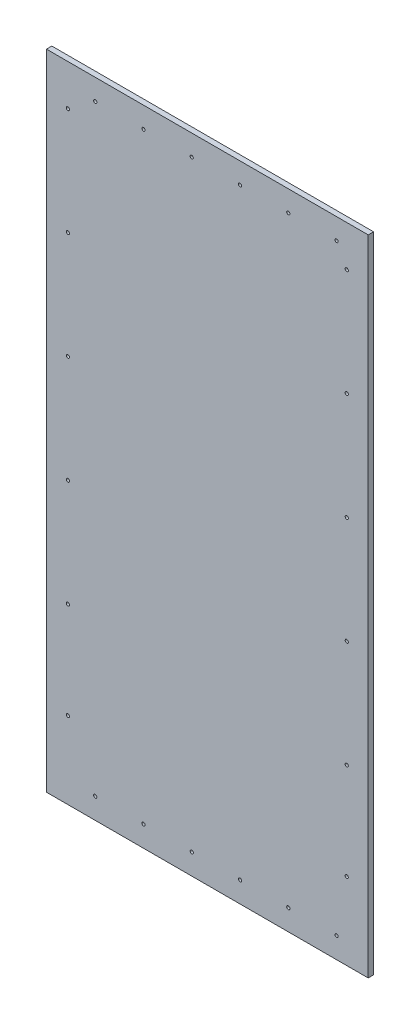
ISO-10303-21;
HEADER;
FILE_DESCRIPTION(('STEP AP214'),'2;1');
FILE_NAME('part.step','',(''),(''),'','','');
FILE_SCHEMA(('AUTOMOTIVE_DESIGN { 1 0 10303 214 1 1 1 1 }'));
ENDSEC;
DATA;
#1=APPLICATION_CONTEXT('core data for automotive mechanical design processes');
#2=APPLICATION_PROTOCOL_DEFINITION('international standard','automotive_design',2000,#1);
#3=PRODUCT_CONTEXT('',#1,'mechanical');
#4=PRODUCT('Part','Part','',(#3));
#5=PRODUCT_RELATED_PRODUCT_CATEGORY('part','',(#4));
#6=PRODUCT_DEFINITION_FORMATION('','',#4);
#7=PRODUCT_DEFINITION_CONTEXT('part definition',#1,'design');
#8=PRODUCT_DEFINITION('design','',#6,#7);
#9=PRODUCT_DEFINITION_SHAPE('','',#8);
#10=(LENGTH_UNIT() NAMED_UNIT(*) SI_UNIT(.MILLI.,.METRE.));
#11=(NAMED_UNIT(*) PLANE_ANGLE_UNIT() SI_UNIT($,.RADIAN.));
#12=(NAMED_UNIT(*) SI_UNIT($,.STERADIAN.) SOLID_ANGLE_UNIT());
#13=UNCERTAINTY_MEASURE_WITH_UNIT(LENGTH_MEASURE(1.E-05),#10,'distance_accuracy_value','');
#14=(GEOMETRIC_REPRESENTATION_CONTEXT(3) GLOBAL_UNCERTAINTY_ASSIGNED_CONTEXT((#13)) GLOBAL_UNIT_ASSIGNED_CONTEXT((#10,
#11,#12)) REPRESENTATION_CONTEXT('',''));
#15=CARTESIAN_POINT('',(0.,0.,0.));
#16=DIRECTION('',(0.,0.,1.));
#17=DIRECTION('',(1.,0.,0.));
#18=AXIS2_PLACEMENT_3D('',#15,#16,#17);
#19=CARTESIAN_POINT('',(150.,300.,5.));
#20=DIRECTION('',(-1.,0.,0.));
#21=DIRECTION('',(0.,-1.,0.));
#22=AXIS2_PLACEMENT_3D('',#19,#20,#21);
#23=PLANE('',#22);
#24=DIRECTION('',(0.,1.,0.));
#25=VECTOR('',#24,1.);
#26=CARTESIAN_POINT('',(150.,300.,0.));
#27=LINE('',#26,#25);
#28=CARTESIAN_POINT('',(150.,-300.,0.));
#29=VERTEX_POINT('',#28);
#30=CARTESIAN_POINT('',(150.,300.,0.));
#31=VERTEX_POINT('',#30);
#32=EDGE_CURVE('E108',#29,#31,#27,.T.);
#33=ORIENTED_EDGE('',*,*,#32,.T.);
#34=DIRECTION('',(0.,0.,-1.));
#35=VECTOR('',#34,1.);
#36=CARTESIAN_POINT('',(150.,300.,5.));
#37=LINE('',#36,#35);
#38=CARTESIAN_POINT('',(150.,300.,5.));
#39=VERTEX_POINT('',#38);
#40=EDGE_CURVE('E11',#39,#31,#37,.T.);
#41=ORIENTED_EDGE('',*,*,#40,.F.);
#42=DIRECTION('',(0.,1.,0.));
#43=VECTOR('',#42,1.);
#44=CARTESIAN_POINT('',(150.,300.,5.));
#45=LINE('',#44,#43);
#46=CARTESIAN_POINT('',(150.,-300.,5.));
#47=VERTEX_POINT('',#46);
#48=EDGE_CURVE('E92',#47,#39,#45,.T.);
#49=ORIENTED_EDGE('',*,*,#48,.F.);
#50=DIRECTION('',(0.,0.,-1.));
#51=VECTOR('',#50,1.);
#52=CARTESIAN_POINT('',(150.,-300.,5.));
#53=LINE('',#52,#51);
#54=EDGE_CURVE('E104',#47,#29,#53,.T.);
#55=ORIENTED_EDGE('',*,*,#54,.T.);
#56=EDGE_LOOP('',(#33,#41,#49,#55));
#57=FACE_BOUND('',#56,.T.);
#58=ADVANCED_FACE('F40',(#57),#23,.F.);
#59=CARTESIAN_POINT('',(-150.,300.,5.));
#60=DIRECTION('',(0.,-1.,0.));
#61=DIRECTION('',(0.,0.,-1.));
#62=AXIS2_PLACEMENT_3D('',#59,#60,#61);
#63=PLANE('',#62);
#64=DIRECTION('',(-1.,0.,0.));
#65=VECTOR('',#64,1.);
#66=CARTESIAN_POINT('',(-150.,300.,0.));
#67=LINE('',#66,#65);
#68=CARTESIAN_POINT('',(-150.,300.,0.));
#69=VERTEX_POINT('',#68);
#70=EDGE_CURVE('E97',#31,#69,#67,.T.);
#71=ORIENTED_EDGE('',*,*,#70,.T.);
#72=DIRECTION('',(0.,0.,-1.));
#73=VECTOR('',#72,1.);
#74=CARTESIAN_POINT('',(-150.,300.,5.));
#75=LINE('',#74,#73);
#76=CARTESIAN_POINT('',(-150.,300.,5.));
#77=VERTEX_POINT('',#76);
#78=EDGE_CURVE('E49',#77,#69,#75,.T.);
#79=ORIENTED_EDGE('',*,*,#78,.F.);
#80=DIRECTION('',(-1.,0.,0.));
#81=VECTOR('',#80,1.);
#82=CARTESIAN_POINT('',(-150.,300.,5.));
#83=LINE('',#82,#81);
#84=EDGE_CURVE('E87',#39,#77,#83,.T.);
#85=ORIENTED_EDGE('',*,*,#84,.F.);
#86=ORIENTED_EDGE('',*,*,#40,.T.);
#87=EDGE_LOOP('',(#71,#79,#85,#86));
#88=FACE_BOUND('',#87,.T.);
#89=ADVANCED_FACE('F96',(#88),#63,.F.);
#90=CARTESIAN_POINT('',(-150.,300.,5.));
#91=DIRECTION('',(1.,0.,0.));
#92=DIRECTION('',(0.,1.,0.));
#93=AXIS2_PLACEMENT_3D('',#90,#91,#92);
#94=PLANE('',#93);
#95=DIRECTION('',(0.,-1.,0.));
#96=VECTOR('',#95,1.);
#97=CARTESIAN_POINT('',(-150.,300.,0.));
#98=LINE('',#97,#96);
#99=CARTESIAN_POINT('',(-150.,-300.,0.));
#100=VERTEX_POINT('',#99);
#101=EDGE_CURVE('E74',#69,#100,#98,.T.);
#102=ORIENTED_EDGE('',*,*,#101,.T.);
#103=DIRECTION('',(0.,0.,-1.));
#104=VECTOR('',#103,1.);
#105=CARTESIAN_POINT('',(-150.,-300.,5.));
#106=LINE('',#105,#104);
#107=CARTESIAN_POINT('',(-150.,-300.,5.));
#108=VERTEX_POINT('',#107);
#109=EDGE_CURVE('E99',#108,#100,#106,.T.);
#110=ORIENTED_EDGE('',*,*,#109,.F.);
#111=DIRECTION('',(0.,-1.,0.));
#112=VECTOR('',#111,1.);
#113=CARTESIAN_POINT('',(-150.,300.,5.));
#114=LINE('',#113,#112);
#115=EDGE_CURVE('E90',#77,#108,#114,.T.);
#116=ORIENTED_EDGE('',*,*,#115,.F.);
#117=ORIENTED_EDGE('',*,*,#78,.T.);
#118=EDGE_LOOP('',(#102,#110,#116,#117));
#119=FACE_BOUND('',#118,.T.);
#120=ADVANCED_FACE('F100',(#119),#94,.F.);
#121=CARTESIAN_POINT('',(-150.,-300.,5.));
#122=DIRECTION('',(0.,1.,0.));
#123=DIRECTION('',(0.,0.,1.));
#124=AXIS2_PLACEMENT_3D('',#121,#122,#123);
#125=PLANE('',#124);
#126=DIRECTION('',(1.,0.,0.));
#127=VECTOR('',#126,1.);
#128=CARTESIAN_POINT('',(-150.,-300.,0.));
#129=LINE('',#128,#127);
#130=EDGE_CURVE('E80',#100,#29,#129,.T.);
#131=ORIENTED_EDGE('',*,*,#130,.T.);
#132=ORIENTED_EDGE('',*,*,#54,.F.);
#133=DIRECTION('',(1.,0.,0.));
#134=VECTOR('',#133,1.);
#135=CARTESIAN_POINT('',(-150.,-300.,5.));
#136=LINE('',#135,#134);
#137=EDGE_CURVE('E57',#108,#47,#136,.T.);
#138=ORIENTED_EDGE('',*,*,#137,.F.);
#139=ORIENTED_EDGE('',*,*,#109,.T.);
#140=EDGE_LOOP('',(#131,#132,#138,#139));
#141=FACE_BOUND('',#140,.T.);
#142=ADVANCED_FACE('F122',(#141),#125,.F.);
#143=CARTESIAN_POINT('',(0.,0.,5.));
#144=DIRECTION('',(0.,0.,1.));
#145=DIRECTION('',(1.,0.,0.));
#146=AXIS2_PLACEMENT_3D('',#143,#144,#145);
#147=PLANE('',#146);
#148=CARTESIAN_POINT('',(130.,-38.12,5.));
#149=DIRECTION('',(0.,0.,1.));
#150=DIRECTION('',(-1.,0.,0.));
#151=AXIS2_PLACEMENT_3D('',#148,#149,#150);
#152=CIRCLE('',#151,1.5);
#153=CARTESIAN_POINT('',(128.5,-38.12,5.));
#154=VERTEX_POINT('',#153);
#155=EDGE_CURVE('E265',#154,#154,#152,.T.);
#156=ORIENTED_EDGE('',*,*,#155,.F.);
#157=EDGE_LOOP('',(#156));
#158=FACE_BOUND('',#157,.T.);
#159=CARTESIAN_POINT('',(130.,-138.12,5.));
#160=DIRECTION('',(0.,0.,1.));
#161=DIRECTION('',(-1.,0.,0.));
#162=AXIS2_PLACEMENT_3D('',#159,#160,#161);
#163=CIRCLE('',#162,1.5);
#164=CARTESIAN_POINT('',(128.5,-138.12,5.));
#165=VERTEX_POINT('',#164);
#166=EDGE_CURVE('E274',#165,#165,#163,.T.);
#167=ORIENTED_EDGE('',*,*,#166,.F.);
#168=EDGE_LOOP('',(#167));
#169=FACE_BOUND('',#168,.T.);
#170=CARTESIAN_POINT('',(130.,-228.12,5.));
#171=DIRECTION('',(0.,0.,1.));
#172=DIRECTION('',(-1.,0.,0.));
#173=AXIS2_PLACEMENT_3D('',#170,#171,#172);
#174=CIRCLE('',#173,1.5);
#175=CARTESIAN_POINT('',(128.5,-228.12,5.));
#176=VERTEX_POINT('',#175);
#177=EDGE_CURVE('E282',#176,#176,#174,.T.);
#178=ORIENTED_EDGE('',*,*,#177,.F.);
#179=EDGE_LOOP('',(#178));
#180=FACE_BOUND('',#179,.T.);
#181=CARTESIAN_POINT('',(-130.,-228.12,5.));
#182=DIRECTION('',(0.,0.,1.));
#183=DIRECTION('',(1.,0.,0.));
#184=AXIS2_PLACEMENT_3D('',#181,#182,#183);
#185=CIRCLE('',#184,1.5);
#186=CARTESIAN_POINT('',(-128.5,-228.12,5.));
#187=VERTEX_POINT('',#186);
#188=EDGE_CURVE('E290',#187,#187,#185,.T.);
#189=ORIENTED_EDGE('',*,*,#188,.F.);
#190=EDGE_LOOP('',(#189));
#191=FACE_BOUND('',#190,.T.);
#192=CARTESIAN_POINT('',(-130.,-138.12,5.));
#193=DIRECTION('',(0.,0.,1.));
#194=DIRECTION('',(1.,0.,0.));
#195=AXIS2_PLACEMENT_3D('',#192,#193,#194);
#196=CIRCLE('',#195,1.5);
#197=CARTESIAN_POINT('',(-128.5,-138.12,5.));
#198=VERTEX_POINT('',#197);
#199=EDGE_CURVE('E233',#198,#198,#196,.T.);
#200=ORIENTED_EDGE('',*,*,#199,.F.);
#201=EDGE_LOOP('',(#200));
#202=FACE_BOUND('',#201,.T.);
#203=CARTESIAN_POINT('',(-130.,-38.12,5.));
#204=DIRECTION('',(0.,0.,1.));
#205=DIRECTION('',(1.,0.,0.));
#206=AXIS2_PLACEMENT_3D('',#203,#204,#205);
#207=CIRCLE('',#206,1.5);
#208=CARTESIAN_POINT('',(-128.5,-38.12,5.));
#209=VERTEX_POINT('',#208);
#210=EDGE_CURVE('E242',#209,#209,#207,.T.);
#211=ORIENTED_EDGE('',*,*,#210,.F.);
#212=EDGE_LOOP('',(#211));
#213=FACE_BOUND('',#212,.T.);
#214=CARTESIAN_POINT('',(-130.,61.88,5.));
#215=DIRECTION('',(0.,0.,1.));
#216=DIRECTION('',(1.,0.,0.));
#217=AXIS2_PLACEMENT_3D('',#214,#215,#216);
#218=CIRCLE('',#217,1.5);
#219=CARTESIAN_POINT('',(-128.5,61.88,5.));
#220=VERTEX_POINT('',#219);
#221=EDGE_CURVE('E250',#220,#220,#218,.T.);
#222=ORIENTED_EDGE('',*,*,#221,.F.);
#223=EDGE_LOOP('',(#222));
#224=FACE_BOUND('',#223,.T.);
#225=CARTESIAN_POINT('',(-130.,161.88,5.));
#226=DIRECTION('',(0.,0.,1.));
#227=DIRECTION('',(1.,0.,0.));
#228=AXIS2_PLACEMENT_3D('',#225,#226,#227);
#229=CIRCLE('',#228,1.5);
#230=CARTESIAN_POINT('',(-128.5,161.88,5.));
#231=VERTEX_POINT('',#230);
#232=EDGE_CURVE('E258',#231,#231,#229,.T.);
#233=ORIENTED_EDGE('',*,*,#232,.F.);
#234=EDGE_LOOP('',(#233));
#235=FACE_BOUND('',#234,.T.);
#236=CARTESIAN_POINT('',(130.,61.8800000000001,5.));
#237=DIRECTION('',(0.,0.,1.));
#238=DIRECTION('',(-1.,0.,0.));
#239=AXIS2_PLACEMENT_3D('',#236,#237,#238);
#240=CIRCLE('',#239,1.5);
#241=CARTESIAN_POINT('',(128.5,61.8800000000001,5.));
#242=VERTEX_POINT('',#241);
#243=EDGE_CURVE('E313',#242,#242,#240,.T.);
#244=ORIENTED_EDGE('',*,*,#243,.F.);
#245=EDGE_LOOP('',(#244));
#246=FACE_BOUND('',#245,.T.);
#247=CARTESIAN_POINT('',(130.,161.88,5.));
#248=DIRECTION('',(0.,0.,1.));
#249=DIRECTION('',(-1.,0.,0.));
#250=AXIS2_PLACEMENT_3D('',#247,#248,#249);
#251=CIRCLE('',#250,1.5);
#252=CARTESIAN_POINT('',(128.5,161.88,5.));
#253=VERTEX_POINT('',#252);
#254=EDGE_CURVE('E305',#253,#253,#251,.T.);
#255=ORIENTED_EDGE('',*,*,#254,.F.);
#256=EDGE_LOOP('',(#255));
#257=FACE_BOUND('',#256,.T.);
#258=CARTESIAN_POINT('',(130.,261.88,5.));
#259=DIRECTION('',(0.,0.,1.));
#260=DIRECTION('',(-1.,0.,0.));
#261=AXIS2_PLACEMENT_3D('',#258,#259,#260);
#262=CIRCLE('',#261,1.5);
#263=CARTESIAN_POINT('',(128.5,261.88,5.));
#264=VERTEX_POINT('',#263);
#265=EDGE_CURVE('E297',#264,#264,#262,.T.);
#266=ORIENTED_EDGE('',*,*,#265,.F.);
#267=EDGE_LOOP('',(#266));
#268=FACE_BOUND('',#267,.T.);
#269=CARTESIAN_POINT('',(-130.,261.88,5.));
#270=DIRECTION('',(0.,0.,1.));
#271=DIRECTION('',(1.,0.,0.));
#272=AXIS2_PLACEMENT_3D('',#269,#270,#271);
#273=CIRCLE('',#272,1.5);
#274=CARTESIAN_POINT('',(-128.5,261.88,5.));
#275=VERTEX_POINT('',#274);
#276=EDGE_CURVE('E225',#275,#275,#273,.T.);
#277=ORIENTED_EDGE('',*,*,#276,.F.);
#278=EDGE_LOOP('',(#277));
#279=FACE_BOUND('',#278,.T.);
#280=CARTESIAN_POINT('',(30.5000000000001,-280.5,5.));
#281=DIRECTION('',(0.,0.,1.));
#282=DIRECTION('',(-1.,0.,0.));
#283=AXIS2_PLACEMENT_3D('',#280,#281,#282);
#284=CIRCLE('',#283,1.5);
#285=CARTESIAN_POINT('',(29.0000000000001,-280.5,5.));
#286=VERTEX_POINT('',#285);
#287=EDGE_CURVE('E169',#286,#286,#284,.T.);
#288=ORIENTED_EDGE('',*,*,#287,.F.);
#289=EDGE_LOOP('',(#288));
#290=FACE_BOUND('',#289,.T.);
#291=CARTESIAN_POINT('',(75.5000000000001,-280.5,5.));
#292=DIRECTION('',(0.,0.,1.));
#293=DIRECTION('',(-1.,0.,0.));
#294=AXIS2_PLACEMENT_3D('',#291,#292,#293);
#295=CIRCLE('',#294,1.5);
#296=CARTESIAN_POINT('',(74.0000000000001,-280.5,5.));
#297=VERTEX_POINT('',#296);
#298=EDGE_CURVE('E178',#297,#297,#295,.T.);
#299=ORIENTED_EDGE('',*,*,#298,.F.);
#300=EDGE_LOOP('',(#299));
#301=FACE_BOUND('',#300,.T.);
#302=CARTESIAN_POINT('',(120.5,-280.5,5.));
#303=DIRECTION('',(0.,0.,1.));
#304=DIRECTION('',(-1.,0.,0.));
#305=AXIS2_PLACEMENT_3D('',#302,#303,#304);
#306=CIRCLE('',#305,1.5);
#307=CARTESIAN_POINT('',(119.,-280.5,5.));
#308=VERTEX_POINT('',#307);
#309=EDGE_CURVE('E186',#308,#308,#306,.T.);
#310=ORIENTED_EDGE('',*,*,#309,.F.);
#311=EDGE_LOOP('',(#310));
#312=FACE_BOUND('',#311,.T.);
#313=CARTESIAN_POINT('',(120.5,280.5,5.));
#314=DIRECTION('',(0.,0.,1.));
#315=DIRECTION('',(1.,0.,0.));
#316=AXIS2_PLACEMENT_3D('',#313,#314,#315);
#317=CIRCLE('',#316,1.5);
#318=CARTESIAN_POINT('',(122.,280.5,5.));
#319=VERTEX_POINT('',#318);
#320=EDGE_CURVE('E194',#319,#319,#317,.T.);
#321=ORIENTED_EDGE('',*,*,#320,.F.);
#322=EDGE_LOOP('',(#321));
#323=FACE_BOUND('',#322,.T.);
#324=CARTESIAN_POINT('',(75.5,280.5,5.));
#325=DIRECTION('',(0.,0.,1.));
#326=DIRECTION('',(1.,0.,0.));
#327=AXIS2_PLACEMENT_3D('',#324,#325,#326);
#328=CIRCLE('',#327,1.5);
#329=CARTESIAN_POINT('',(77.,280.5,5.));
#330=VERTEX_POINT('',#329);
#331=EDGE_CURVE('E137',#330,#330,#328,.T.);
#332=ORIENTED_EDGE('',*,*,#331,.F.);
#333=EDGE_LOOP('',(#332));
#334=FACE_BOUND('',#333,.T.);
#335=CARTESIAN_POINT('',(30.5,280.5,5.));
#336=DIRECTION('',(0.,0.,1.));
#337=DIRECTION('',(1.,0.,0.));
#338=AXIS2_PLACEMENT_3D('',#335,#336,#337);
#339=CIRCLE('',#338,1.5);
#340=CARTESIAN_POINT('',(32.,280.5,5.));
#341=VERTEX_POINT('',#340);
#342=EDGE_CURVE('E146',#341,#341,#339,.T.);
#343=ORIENTED_EDGE('',*,*,#342,.F.);
#344=EDGE_LOOP('',(#343));
#345=FACE_BOUND('',#344,.T.);
#346=CARTESIAN_POINT('',(-14.5,280.5,5.));
#347=DIRECTION('',(0.,0.,1.));
#348=DIRECTION('',(1.,0.,0.));
#349=AXIS2_PLACEMENT_3D('',#346,#347,#348);
#350=CIRCLE('',#349,1.5);
#351=CARTESIAN_POINT('',(-13.,280.5,5.));
#352=VERTEX_POINT('',#351);
#353=EDGE_CURVE('E154',#352,#352,#350,.T.);
#354=ORIENTED_EDGE('',*,*,#353,.F.);
#355=EDGE_LOOP('',(#354));
#356=FACE_BOUND('',#355,.T.);
#357=CARTESIAN_POINT('',(-59.5,280.5,5.));
#358=DIRECTION('',(0.,0.,1.));
#359=DIRECTION('',(1.,0.,0.));
#360=AXIS2_PLACEMENT_3D('',#357,#358,#359);
#361=CIRCLE('',#360,1.5);
#362=CARTESIAN_POINT('',(-58.,280.5,5.));
#363=VERTEX_POINT('',#362);
#364=EDGE_CURVE('E162',#363,#363,#361,.T.);
#365=ORIENTED_EDGE('',*,*,#364,.F.);
#366=EDGE_LOOP('',(#365));
#367=FACE_BOUND('',#366,.T.);
#368=CARTESIAN_POINT('',(-14.4999999999999,-280.5,5.));
#369=DIRECTION('',(0.,0.,1.));
#370=DIRECTION('',(-1.,0.,0.));
#371=AXIS2_PLACEMENT_3D('',#368,#369,#370);
#372=CIRCLE('',#371,1.5);
#373=CARTESIAN_POINT('',(-15.9999999999999,-280.5,5.));
#374=VERTEX_POINT('',#373);
#375=EDGE_CURVE('E218',#374,#374,#372,.T.);
#376=ORIENTED_EDGE('',*,*,#375,.F.);
#377=EDGE_LOOP('',(#376));
#378=FACE_BOUND('',#377,.T.);
#379=CARTESIAN_POINT('',(-59.4999999999999,-280.5,5.));
#380=DIRECTION('',(0.,0.,1.));
#381=DIRECTION('',(-1.,0.,0.));
#382=AXIS2_PLACEMENT_3D('',#379,#380,#381);
#383=CIRCLE('',#382,1.5);
#384=CARTESIAN_POINT('',(-60.9999999999999,-280.5,5.));
#385=VERTEX_POINT('',#384);
#386=EDGE_CURVE('E210',#385,#385,#383,.T.);
#387=ORIENTED_EDGE('',*,*,#386,.F.);
#388=EDGE_LOOP('',(#387));
#389=FACE_BOUND('',#388,.T.);
#390=CARTESIAN_POINT('',(-104.5,-280.5,5.));
#391=DIRECTION('',(0.,0.,1.));
#392=DIRECTION('',(-1.,0.,0.));
#393=AXIS2_PLACEMENT_3D('',#390,#391,#392);
#394=CIRCLE('',#393,1.5);
#395=CARTESIAN_POINT('',(-106.,-280.5,5.));
#396=VERTEX_POINT('',#395);
#397=EDGE_CURVE('E201',#396,#396,#394,.T.);
#398=ORIENTED_EDGE('',*,*,#397,.F.);
#399=EDGE_LOOP('',(#398));
#400=FACE_BOUND('',#399,.T.);
#401=CARTESIAN_POINT('',(-104.5,280.5,5.));
#402=DIRECTION('',(0.,0.,1.));
#403=DIRECTION('',(1.,0.,0.));
#404=AXIS2_PLACEMENT_3D('',#401,#402,#403);
#405=CIRCLE('',#404,1.5);
#406=CARTESIAN_POINT('',(-103.,280.5,5.));
#407=VERTEX_POINT('',#406);
#408=EDGE_CURVE('E129',#407,#407,#405,.T.);
#409=ORIENTED_EDGE('',*,*,#408,.F.);
#410=EDGE_LOOP('',(#409));
#411=FACE_BOUND('',#410,.T.);
#412=ORIENTED_EDGE('',*,*,#48,.T.);
#413=ORIENTED_EDGE('',*,*,#84,.T.);
#414=ORIENTED_EDGE('',*,*,#115,.T.);
#415=ORIENTED_EDGE('',*,*,#137,.T.);
#416=EDGE_LOOP('',(#412,#413,#414,#415));
#417=FACE_BOUND('',#416,.T.);
#418=ADVANCED_FACE('F88',(#158,#169,#180,#191,#202,#213,#224,#235,#246,#257,#268,#279,#290,#301,
#312,#323,#334,#345,#356,#367,#378,#389,#400,#411,#417),#147,.T.);
#419=CARTESIAN_POINT('',(0.,0.,0.));
#420=DIRECTION('',(0.,0.,1.));
#421=DIRECTION('',(1.,0.,0.));
#422=AXIS2_PLACEMENT_3D('',#419,#420,#421);
#423=PLANE('',#422);
#424=CARTESIAN_POINT('',(130.,-38.12,0.));
#425=DIRECTION('',(0.,0.,1.));
#426=DIRECTION('',(-1.,0.,0.));
#427=AXIS2_PLACEMENT_3D('',#424,#425,#426);
#428=CIRCLE('',#427,1.5);
#429=CARTESIAN_POINT('',(128.5,-38.12,0.));
#430=VERTEX_POINT('',#429);
#431=EDGE_CURVE('E269',#430,#430,#428,.T.);
#432=ORIENTED_EDGE('',*,*,#431,.T.);
#433=EDGE_LOOP('',(#432));
#434=FACE_BOUND('',#433,.T.);
#435=CARTESIAN_POINT('',(130.,-138.12,0.));
#436=DIRECTION('',(0.,0.,1.));
#437=DIRECTION('',(-1.,0.,0.));
#438=AXIS2_PLACEMENT_3D('',#435,#436,#437);
#439=CIRCLE('',#438,1.5);
#440=CARTESIAN_POINT('',(128.5,-138.12,0.));
#441=VERTEX_POINT('',#440);
#442=EDGE_CURVE('E278',#441,#441,#439,.T.);
#443=ORIENTED_EDGE('',*,*,#442,.T.);
#444=EDGE_LOOP('',(#443));
#445=FACE_BOUND('',#444,.T.);
#446=CARTESIAN_POINT('',(130.,-228.12,0.));
#447=DIRECTION('',(0.,0.,1.));
#448=DIRECTION('',(-1.,0.,0.));
#449=AXIS2_PLACEMENT_3D('',#446,#447,#448);
#450=CIRCLE('',#449,1.5);
#451=CARTESIAN_POINT('',(128.5,-228.12,0.));
#452=VERTEX_POINT('',#451);
#453=EDGE_CURVE('E286',#452,#452,#450,.T.);
#454=ORIENTED_EDGE('',*,*,#453,.T.);
#455=EDGE_LOOP('',(#454));
#456=FACE_BOUND('',#455,.T.);
#457=CARTESIAN_POINT('',(-130.,-228.12,0.));
#458=DIRECTION('',(0.,0.,1.));
#459=DIRECTION('',(1.,0.,0.));
#460=AXIS2_PLACEMENT_3D('',#457,#458,#459);
#461=CIRCLE('',#460,1.5);
#462=CARTESIAN_POINT('',(-128.5,-228.12,0.));
#463=VERTEX_POINT('',#462);
#464=EDGE_CURVE('E238',#463,#463,#461,.T.);
#465=ORIENTED_EDGE('',*,*,#464,.T.);
#466=EDGE_LOOP('',(#465));
#467=FACE_BOUND('',#466,.T.);
#468=CARTESIAN_POINT('',(-130.,-138.12,0.));
#469=DIRECTION('',(0.,0.,1.));
#470=DIRECTION('',(1.,0.,0.));
#471=AXIS2_PLACEMENT_3D('',#468,#469,#470);
#472=CIRCLE('',#471,1.5);
#473=CARTESIAN_POINT('',(-128.5,-138.12,0.));
#474=VERTEX_POINT('',#473);
#475=EDGE_CURVE('E237',#474,#474,#472,.T.);
#476=ORIENTED_EDGE('',*,*,#475,.T.);
#477=EDGE_LOOP('',(#476));
#478=FACE_BOUND('',#477,.T.);
#479=CARTESIAN_POINT('',(-130.,-38.12,0.));
#480=DIRECTION('',(0.,0.,1.));
#481=DIRECTION('',(1.,0.,0.));
#482=AXIS2_PLACEMENT_3D('',#479,#480,#481);
#483=CIRCLE('',#482,1.5);
#484=CARTESIAN_POINT('',(-128.5,-38.12,0.));
#485=VERTEX_POINT('',#484);
#486=EDGE_CURVE('E246',#485,#485,#483,.T.);
#487=ORIENTED_EDGE('',*,*,#486,.T.);
#488=EDGE_LOOP('',(#487));
#489=FACE_BOUND('',#488,.T.);
#490=CARTESIAN_POINT('',(-130.,61.88,0.));
#491=DIRECTION('',(0.,0.,1.));
#492=DIRECTION('',(1.,0.,0.));
#493=AXIS2_PLACEMENT_3D('',#490,#491,#492);
#494=CIRCLE('',#493,1.5);
#495=CARTESIAN_POINT('',(-128.5,61.88,0.));
#496=VERTEX_POINT('',#495);
#497=EDGE_CURVE('E254',#496,#496,#494,.T.);
#498=ORIENTED_EDGE('',*,*,#497,.T.);
#499=EDGE_LOOP('',(#498));
#500=FACE_BOUND('',#499,.T.);
#501=CARTESIAN_POINT('',(-130.,161.88,0.));
#502=DIRECTION('',(0.,0.,1.));
#503=DIRECTION('',(1.,0.,0.));
#504=AXIS2_PLACEMENT_3D('',#501,#502,#503);
#505=CIRCLE('',#504,1.5);
#506=CARTESIAN_POINT('',(-128.5,161.88,0.));
#507=VERTEX_POINT('',#506);
#508=EDGE_CURVE('E229',#507,#507,#505,.T.);
#509=ORIENTED_EDGE('',*,*,#508,.T.);
#510=EDGE_LOOP('',(#509));
#511=FACE_BOUND('',#510,.T.);
#512=CARTESIAN_POINT('',(130.,61.8800000000001,0.));
#513=DIRECTION('',(0.,0.,1.));
#514=DIRECTION('',(-1.,0.,0.));
#515=AXIS2_PLACEMENT_3D('',#512,#513,#514);
#516=CIRCLE('',#515,1.5);
#517=CARTESIAN_POINT('',(128.5,61.8800000000001,0.));
#518=VERTEX_POINT('',#517);
#519=EDGE_CURVE('E270',#518,#518,#516,.T.);
#520=ORIENTED_EDGE('',*,*,#519,.T.);
#521=EDGE_LOOP('',(#520));
#522=FACE_BOUND('',#521,.T.);
#523=CARTESIAN_POINT('',(130.,161.88,0.));
#524=DIRECTION('',(0.,0.,1.));
#525=DIRECTION('',(-1.,0.,0.));
#526=AXIS2_PLACEMENT_3D('',#523,#524,#525);
#527=CIRCLE('',#526,1.5);
#528=CARTESIAN_POINT('',(128.5,161.88,0.));
#529=VERTEX_POINT('',#528);
#530=EDGE_CURVE('E309',#529,#529,#527,.T.);
#531=ORIENTED_EDGE('',*,*,#530,.T.);
#532=EDGE_LOOP('',(#531));
#533=FACE_BOUND('',#532,.T.);
#534=CARTESIAN_POINT('',(130.,261.88,0.));
#535=DIRECTION('',(0.,0.,1.));
#536=DIRECTION('',(-1.,0.,0.));
#537=AXIS2_PLACEMENT_3D('',#534,#535,#536);
#538=CIRCLE('',#537,1.5);
#539=CARTESIAN_POINT('',(128.5,261.88,0.));
#540=VERTEX_POINT('',#539);
#541=EDGE_CURVE('E301',#540,#540,#538,.T.);
#542=ORIENTED_EDGE('',*,*,#541,.T.);
#543=EDGE_LOOP('',(#542));
#544=FACE_BOUND('',#543,.T.);
#545=CARTESIAN_POINT('',(-130.,261.88,0.));
#546=DIRECTION('',(0.,0.,1.));
#547=DIRECTION('',(1.,0.,0.));
#548=AXIS2_PLACEMENT_3D('',#545,#546,#547);
#549=CIRCLE('',#548,1.5);
#550=CARTESIAN_POINT('',(-128.5,261.88,0.));
#551=VERTEX_POINT('',#550);
#552=EDGE_CURVE('E206',#551,#551,#549,.T.);
#553=ORIENTED_EDGE('',*,*,#552,.T.);
#554=EDGE_LOOP('',(#553));
#555=FACE_BOUND('',#554,.T.);
#556=CARTESIAN_POINT('',(30.5000000000001,-280.5,0.));
#557=DIRECTION('',(0.,0.,1.));
#558=DIRECTION('',(-1.,0.,0.));
#559=AXIS2_PLACEMENT_3D('',#556,#557,#558);
#560=CIRCLE('',#559,1.5);
#561=CARTESIAN_POINT('',(29.0000000000001,-280.5,0.));
#562=VERTEX_POINT('',#561);
#563=EDGE_CURVE('E173',#562,#562,#560,.T.);
#564=ORIENTED_EDGE('',*,*,#563,.T.);
#565=EDGE_LOOP('',(#564));
#566=FACE_BOUND('',#565,.T.);
#567=CARTESIAN_POINT('',(75.5000000000001,-280.5,0.));
#568=DIRECTION('',(0.,0.,1.));
#569=DIRECTION('',(-1.,0.,0.));
#570=AXIS2_PLACEMENT_3D('',#567,#568,#569);
#571=CIRCLE('',#570,1.5);
#572=CARTESIAN_POINT('',(74.0000000000001,-280.5,0.));
#573=VERTEX_POINT('',#572);
#574=EDGE_CURVE('E182',#573,#573,#571,.T.);
#575=ORIENTED_EDGE('',*,*,#574,.T.);
#576=EDGE_LOOP('',(#575));
#577=FACE_BOUND('',#576,.T.);
#578=CARTESIAN_POINT('',(120.5,-280.5,0.));
#579=DIRECTION('',(0.,0.,1.));
#580=DIRECTION('',(-1.,0.,0.));
#581=AXIS2_PLACEMENT_3D('',#578,#579,#580);
#582=CIRCLE('',#581,1.5);
#583=CARTESIAN_POINT('',(119.,-280.5,0.));
#584=VERTEX_POINT('',#583);
#585=EDGE_CURVE('E190',#584,#584,#582,.T.);
#586=ORIENTED_EDGE('',*,*,#585,.T.);
#587=EDGE_LOOP('',(#586));
#588=FACE_BOUND('',#587,.T.);
#589=CARTESIAN_POINT('',(120.5,280.5,0.));
#590=DIRECTION('',(0.,0.,1.));
#591=DIRECTION('',(1.,0.,0.));
#592=AXIS2_PLACEMENT_3D('',#589,#590,#591);
#593=CIRCLE('',#592,1.5);
#594=CARTESIAN_POINT('',(122.,280.5,0.));
#595=VERTEX_POINT('',#594);
#596=EDGE_CURVE('E142',#595,#595,#593,.T.);
#597=ORIENTED_EDGE('',*,*,#596,.T.);
#598=EDGE_LOOP('',(#597));
#599=FACE_BOUND('',#598,.T.);
#600=CARTESIAN_POINT('',(75.5,280.5,0.));
#601=DIRECTION('',(0.,0.,1.));
#602=DIRECTION('',(1.,0.,0.));
#603=AXIS2_PLACEMENT_3D('',#600,#601,#602);
#604=CIRCLE('',#603,1.5);
#605=CARTESIAN_POINT('',(77.,280.5,0.));
#606=VERTEX_POINT('',#605);
#607=EDGE_CURVE('E141',#606,#606,#604,.T.);
#608=ORIENTED_EDGE('',*,*,#607,.T.);
#609=EDGE_LOOP('',(#608));
#610=FACE_BOUND('',#609,.T.);
#611=CARTESIAN_POINT('',(30.5,280.5,0.));
#612=DIRECTION('',(0.,0.,1.));
#613=DIRECTION('',(1.,0.,0.));
#614=AXIS2_PLACEMENT_3D('',#611,#612,#613);
#615=CIRCLE('',#614,1.5);
#616=CARTESIAN_POINT('',(32.,280.5,0.));
#617=VERTEX_POINT('',#616);
#618=EDGE_CURVE('E150',#617,#617,#615,.T.);
#619=ORIENTED_EDGE('',*,*,#618,.T.);
#620=EDGE_LOOP('',(#619));
#621=FACE_BOUND('',#620,.T.);
#622=CARTESIAN_POINT('',(-14.5,280.5,0.));
#623=DIRECTION('',(0.,0.,1.));
#624=DIRECTION('',(1.,0.,0.));
#625=AXIS2_PLACEMENT_3D('',#622,#623,#624);
#626=CIRCLE('',#625,1.5);
#627=CARTESIAN_POINT('',(-13.,280.5,0.));
#628=VERTEX_POINT('',#627);
#629=EDGE_CURVE('E158',#628,#628,#626,.T.);
#630=ORIENTED_EDGE('',*,*,#629,.T.);
#631=EDGE_LOOP('',(#630));
#632=FACE_BOUND('',#631,.T.);
#633=CARTESIAN_POINT('',(-59.5,280.5,0.));
#634=DIRECTION('',(0.,0.,1.));
#635=DIRECTION('',(1.,0.,0.));
#636=AXIS2_PLACEMENT_3D('',#633,#634,#635);
#637=CIRCLE('',#636,1.5);
#638=CARTESIAN_POINT('',(-58.,280.5,0.));
#639=VERTEX_POINT('',#638);
#640=EDGE_CURVE('E133',#639,#639,#637,.T.);
#641=ORIENTED_EDGE('',*,*,#640,.T.);
#642=EDGE_LOOP('',(#641));
#643=FACE_BOUND('',#642,.T.);
#644=CARTESIAN_POINT('',(-14.4999999999999,-280.5,0.));
#645=DIRECTION('',(0.,0.,1.));
#646=DIRECTION('',(-1.,0.,0.));
#647=AXIS2_PLACEMENT_3D('',#644,#645,#646);
#648=CIRCLE('',#647,1.5);
#649=CARTESIAN_POINT('',(-15.9999999999999,-280.5,0.));
#650=VERTEX_POINT('',#649);
#651=EDGE_CURVE('E174',#650,#650,#648,.T.);
#652=ORIENTED_EDGE('',*,*,#651,.T.);
#653=EDGE_LOOP('',(#652));
#654=FACE_BOUND('',#653,.T.);
#655=CARTESIAN_POINT('',(-59.4999999999999,-280.5,0.));
#656=DIRECTION('',(0.,0.,1.));
#657=DIRECTION('',(-1.,0.,0.));
#658=AXIS2_PLACEMENT_3D('',#655,#656,#657);
#659=CIRCLE('',#658,1.5);
#660=CARTESIAN_POINT('',(-60.9999999999999,-280.5,0.));
#661=VERTEX_POINT('',#660);
#662=EDGE_CURVE('E214',#661,#661,#659,.T.);
#663=ORIENTED_EDGE('',*,*,#662,.T.);
#664=EDGE_LOOP('',(#663));
#665=FACE_BOUND('',#664,.T.);
#666=CARTESIAN_POINT('',(-104.5,-280.5,0.));
#667=DIRECTION('',(0.,0.,1.));
#668=DIRECTION('',(-1.,0.,0.));
#669=AXIS2_PLACEMENT_3D('',#666,#667,#668);
#670=CIRCLE('',#669,1.5);
#671=CARTESIAN_POINT('',(-106.,-280.5,0.));
#672=VERTEX_POINT('',#671);
#673=EDGE_CURVE('E205',#672,#672,#670,.T.);
#674=ORIENTED_EDGE('',*,*,#673,.T.);
#675=EDGE_LOOP('',(#674));
#676=FACE_BOUND('',#675,.T.);
#677=CARTESIAN_POINT('',(-104.5,280.5,0.));
#678=DIRECTION('',(0.,0.,1.));
#679=DIRECTION('',(1.,0.,0.));
#680=AXIS2_PLACEMENT_3D('',#677,#678,#679);
#681=CIRCLE('',#680,1.5);
#682=CARTESIAN_POINT('',(-103.,280.5,0.));
#683=VERTEX_POINT('',#682);
#684=EDGE_CURVE('E112',#683,#683,#681,.T.);
#685=ORIENTED_EDGE('',*,*,#684,.T.);
#686=EDGE_LOOP('',(#685));
#687=FACE_BOUND('',#686,.T.);
#688=ORIENTED_EDGE('',*,*,#32,.F.);
#689=ORIENTED_EDGE('',*,*,#130,.F.);
#690=ORIENTED_EDGE('',*,*,#101,.F.);
#691=ORIENTED_EDGE('',*,*,#70,.F.);
#692=EDGE_LOOP('',(#688,#689,#690,#691));
#693=FACE_BOUND('',#692,.T.);
#694=ADVANCED_FACE('F125',(#434,#445,#456,#467,#478,#489,#500,#511,#522,#533,#544,#555,#566,
#577,#588,#599,#610,#621,#632,#643,#654,#665,#676,#687,#693),#423,.F.);
#695=CARTESIAN_POINT('',(-104.5,280.5,0.));
#696=DIRECTION('',(0.,0.,1.));
#697=DIRECTION('',(1.,0.,0.));
#698=AXIS2_PLACEMENT_3D('',#695,#696,#697);
#699=CYLINDRICAL_SURFACE('',#698,1.5);
#700=ORIENTED_EDGE('',*,*,#684,.F.);
#701=EDGE_LOOP('',(#700));
#702=FACE_BOUND('',#701,.T.);
#703=ORIENTED_EDGE('',*,*,#408,.T.);
#704=EDGE_LOOP('',(#703));
#705=FACE_BOUND('',#704,.T.);
#706=ADVANCED_FACE('F365',(#702,#705),#699,.F.);
#707=CARTESIAN_POINT('',(-104.5,-280.5,0.));
#708=DIRECTION('',(0.,0.,1.));
#709=DIRECTION('',(1.,0.,0.));
#710=AXIS2_PLACEMENT_3D('',#707,#708,#709);
#711=CYLINDRICAL_SURFACE('',#710,1.5);
#712=ORIENTED_EDGE('',*,*,#673,.F.);
#713=EDGE_LOOP('',(#712));
#714=FACE_BOUND('',#713,.T.);
#715=ORIENTED_EDGE('',*,*,#397,.T.);
#716=EDGE_LOOP('',(#715));
#717=FACE_BOUND('',#716,.T.);
#718=ADVANCED_FACE('F367',(#714,#717),#711,.F.);
#719=CARTESIAN_POINT('',(-59.4999999999999,-280.5,0.));
#720=DIRECTION('',(0.,0.,1.));
#721=DIRECTION('',(1.,0.,0.));
#722=AXIS2_PLACEMENT_3D('',#719,#720,#721);
#723=CYLINDRICAL_SURFACE('',#722,1.5);
#724=ORIENTED_EDGE('',*,*,#662,.F.);
#725=EDGE_LOOP('',(#724));
#726=FACE_BOUND('',#725,.T.);
#727=ORIENTED_EDGE('',*,*,#386,.T.);
#728=EDGE_LOOP('',(#727));
#729=FACE_BOUND('',#728,.T.);
#730=ADVANCED_FACE('F374',(#726,#729),#723,.F.);
#731=CARTESIAN_POINT('',(-14.4999999999999,-280.5,0.));
#732=DIRECTION('',(0.,0.,1.));
#733=DIRECTION('',(1.,0.,0.));
#734=AXIS2_PLACEMENT_3D('',#731,#732,#733);
#735=CYLINDRICAL_SURFACE('',#734,1.5);
#736=ORIENTED_EDGE('',*,*,#651,.F.);
#737=EDGE_LOOP('',(#736));
#738=FACE_BOUND('',#737,.T.);
#739=ORIENTED_EDGE('',*,*,#375,.T.);
#740=EDGE_LOOP('',(#739));
#741=FACE_BOUND('',#740,.T.);
#742=ADVANCED_FACE('F532',(#738,#741),#735,.F.);
#743=CARTESIAN_POINT('',(-59.5,280.5,0.));
#744=DIRECTION('',(0.,0.,1.));
#745=DIRECTION('',(1.,0.,0.));
#746=AXIS2_PLACEMENT_3D('',#743,#744,#745);
#747=CYLINDRICAL_SURFACE('',#746,1.5);
#748=ORIENTED_EDGE('',*,*,#640,.F.);
#749=EDGE_LOOP('',(#748));
#750=FACE_BOUND('',#749,.T.);
#751=ORIENTED_EDGE('',*,*,#364,.T.);
#752=EDGE_LOOP('',(#751));
#753=FACE_BOUND('',#752,.T.);
#754=ADVANCED_FACE('F535',(#750,#753),#747,.F.);
#755=CARTESIAN_POINT('',(-14.5,280.5,0.));
#756=DIRECTION('',(0.,0.,1.));
#757=DIRECTION('',(1.,0.,0.));
#758=AXIS2_PLACEMENT_3D('',#755,#756,#757);
#759=CYLINDRICAL_SURFACE('',#758,1.5);
#760=ORIENTED_EDGE('',*,*,#629,.F.);
#761=EDGE_LOOP('',(#760));
#762=FACE_BOUND('',#761,.T.);
#763=ORIENTED_EDGE('',*,*,#353,.T.);
#764=EDGE_LOOP('',(#763));
#765=FACE_BOUND('',#764,.T.);
#766=ADVANCED_FACE('F557',(#762,#765),#759,.F.);
#767=CARTESIAN_POINT('',(30.5,280.5,0.));
#768=DIRECTION('',(0.,0.,1.));
#769=DIRECTION('',(1.,0.,0.));
#770=AXIS2_PLACEMENT_3D('',#767,#768,#769);
#771=CYLINDRICAL_SURFACE('',#770,1.5);
#772=ORIENTED_EDGE('',*,*,#618,.F.);
#773=EDGE_LOOP('',(#772));
#774=FACE_BOUND('',#773,.T.);
#775=ORIENTED_EDGE('',*,*,#342,.T.);
#776=EDGE_LOOP('',(#775));
#777=FACE_BOUND('',#776,.T.);
#778=ADVANCED_FACE('F561',(#774,#777),#771,.F.);
#779=CARTESIAN_POINT('',(75.5,280.5,0.));
#780=DIRECTION('',(0.,0.,1.));
#781=DIRECTION('',(1.,0.,0.));
#782=AXIS2_PLACEMENT_3D('',#779,#780,#781);
#783=CYLINDRICAL_SURFACE('',#782,1.5);
#784=ORIENTED_EDGE('',*,*,#607,.F.);
#785=EDGE_LOOP('',(#784));
#786=FACE_BOUND('',#785,.T.);
#787=ORIENTED_EDGE('',*,*,#331,.T.);
#788=EDGE_LOOP('',(#787));
#789=FACE_BOUND('',#788,.T.);
#790=ADVANCED_FACE('F544',(#786,#789),#783,.F.);
#791=CARTESIAN_POINT('',(120.5,280.5,0.));
#792=DIRECTION('',(0.,0.,1.));
#793=DIRECTION('',(1.,0.,0.));
#794=AXIS2_PLACEMENT_3D('',#791,#792,#793);
#795=CYLINDRICAL_SURFACE('',#794,1.5);
#796=ORIENTED_EDGE('',*,*,#596,.F.);
#797=EDGE_LOOP('',(#796));
#798=FACE_BOUND('',#797,.T.);
#799=ORIENTED_EDGE('',*,*,#320,.T.);
#800=EDGE_LOOP('',(#799));
#801=FACE_BOUND('',#800,.T.);
#802=ADVANCED_FACE('F540',(#798,#801),#795,.F.);
#803=CARTESIAN_POINT('',(120.5,-280.5,0.));
#804=DIRECTION('',(0.,0.,1.));
#805=DIRECTION('',(1.,0.,0.));
#806=AXIS2_PLACEMENT_3D('',#803,#804,#805);
#807=CYLINDRICAL_SURFACE('',#806,1.5);
#808=ORIENTED_EDGE('',*,*,#585,.F.);
#809=EDGE_LOOP('',(#808));
#810=FACE_BOUND('',#809,.T.);
#811=ORIENTED_EDGE('',*,*,#309,.T.);
#812=EDGE_LOOP('',(#811));
#813=FACE_BOUND('',#812,.T.);
#814=ADVANCED_FACE('F543',(#810,#813),#807,.F.);
#815=CARTESIAN_POINT('',(75.5000000000001,-280.5,0.));
#816=DIRECTION('',(0.,0.,1.));
#817=DIRECTION('',(1.,0.,0.));
#818=AXIS2_PLACEMENT_3D('',#815,#816,#817);
#819=CYLINDRICAL_SURFACE('',#818,1.5);
#820=ORIENTED_EDGE('',*,*,#574,.F.);
#821=EDGE_LOOP('',(#820));
#822=FACE_BOUND('',#821,.T.);
#823=ORIENTED_EDGE('',*,*,#298,.T.);
#824=EDGE_LOOP('',(#823));
#825=FACE_BOUND('',#824,.T.);
#826=ADVANCED_FACE('F548',(#822,#825),#819,.F.);
#827=CARTESIAN_POINT('',(30.5000000000001,-280.5,0.));
#828=DIRECTION('',(0.,0.,1.));
#829=DIRECTION('',(1.,0.,0.));
#830=AXIS2_PLACEMENT_3D('',#827,#828,#829);
#831=CYLINDRICAL_SURFACE('',#830,1.5);
#832=ORIENTED_EDGE('',*,*,#563,.F.);
#833=EDGE_LOOP('',(#832));
#834=FACE_BOUND('',#833,.T.);
#835=ORIENTED_EDGE('',*,*,#287,.T.);
#836=EDGE_LOOP('',(#835));
#837=FACE_BOUND('',#836,.T.);
#838=ADVANCED_FACE('F419',(#834,#837),#831,.F.);
#839=CARTESIAN_POINT('',(-130.,261.88,0.));
#840=DIRECTION('',(0.,0.,1.));
#841=DIRECTION('',(1.,0.,0.));
#842=AXIS2_PLACEMENT_3D('',#839,#840,#841);
#843=CYLINDRICAL_SURFACE('',#842,1.5);
#844=ORIENTED_EDGE('',*,*,#552,.F.);
#845=EDGE_LOOP('',(#844));
#846=FACE_BOUND('',#845,.T.);
#847=ORIENTED_EDGE('',*,*,#276,.T.);
#848=EDGE_LOOP('',(#847));
#849=FACE_BOUND('',#848,.T.);
#850=ADVANCED_FACE('F413',(#846,#849),#843,.F.);
#851=CARTESIAN_POINT('',(130.,261.88,0.));
#852=DIRECTION('',(0.,0.,1.));
#853=DIRECTION('',(1.,0.,0.));
#854=AXIS2_PLACEMENT_3D('',#851,#852,#853);
#855=CYLINDRICAL_SURFACE('',#854,1.5);
#856=ORIENTED_EDGE('',*,*,#541,.F.);
#857=EDGE_LOOP('',(#856));
#858=FACE_BOUND('',#857,.T.);
#859=ORIENTED_EDGE('',*,*,#265,.T.);
#860=EDGE_LOOP('',(#859));
#861=FACE_BOUND('',#860,.T.);
#862=ADVANCED_FACE('F418',(#858,#861),#855,.F.);
#863=CARTESIAN_POINT('',(130.,161.88,0.));
#864=DIRECTION('',(0.,0.,1.));
#865=DIRECTION('',(1.,0.,0.));
#866=AXIS2_PLACEMENT_3D('',#863,#864,#865);
#867=CYLINDRICAL_SURFACE('',#866,1.5);
#868=ORIENTED_EDGE('',*,*,#530,.F.);
#869=EDGE_LOOP('',(#868));
#870=FACE_BOUND('',#869,.T.);
#871=ORIENTED_EDGE('',*,*,#254,.T.);
#872=EDGE_LOOP('',(#871));
#873=FACE_BOUND('',#872,.T.);
#874=ADVANCED_FACE('F327',(#870,#873),#867,.F.);
#875=CARTESIAN_POINT('',(130.,61.8800000000001,0.));
#876=DIRECTION('',(0.,0.,1.));
#877=DIRECTION('',(1.,0.,0.));
#878=AXIS2_PLACEMENT_3D('',#875,#876,#877);
#879=CYLINDRICAL_SURFACE('',#878,1.5);
#880=ORIENTED_EDGE('',*,*,#519,.F.);
#881=EDGE_LOOP('',(#880));
#882=FACE_BOUND('',#881,.T.);
#883=ORIENTED_EDGE('',*,*,#243,.T.);
#884=EDGE_LOOP('',(#883));
#885=FACE_BOUND('',#884,.T.);
#886=ADVANCED_FACE('F323',(#882,#885),#879,.F.);
#887=CARTESIAN_POINT('',(-130.,161.88,0.));
#888=DIRECTION('',(0.,0.,1.));
#889=DIRECTION('',(1.,0.,0.));
#890=AXIS2_PLACEMENT_3D('',#887,#888,#889);
#891=CYLINDRICAL_SURFACE('',#890,1.5);
#892=ORIENTED_EDGE('',*,*,#508,.F.);
#893=EDGE_LOOP('',(#892));
#894=FACE_BOUND('',#893,.T.);
#895=ORIENTED_EDGE('',*,*,#232,.T.);
#896=EDGE_LOOP('',(#895));
#897=FACE_BOUND('',#896,.T.);
#898=ADVANCED_FACE('F326',(#894,#897),#891,.F.);
#899=CARTESIAN_POINT('',(-130.,61.88,0.));
#900=DIRECTION('',(0.,0.,1.));
#901=DIRECTION('',(1.,0.,0.));
#902=AXIS2_PLACEMENT_3D('',#899,#900,#901);
#903=CYLINDRICAL_SURFACE('',#902,1.5);
#904=ORIENTED_EDGE('',*,*,#497,.F.);
#905=EDGE_LOOP('',(#904));
#906=FACE_BOUND('',#905,.T.);
#907=ORIENTED_EDGE('',*,*,#221,.T.);
#908=EDGE_LOOP('',(#907));
#909=FACE_BOUND('',#908,.T.);
#910=ADVANCED_FACE('F455',(#906,#909),#903,.F.);
#911=CARTESIAN_POINT('',(-130.,-38.12,0.));
#912=DIRECTION('',(0.,0.,1.));
#913=DIRECTION('',(1.,0.,0.));
#914=AXIS2_PLACEMENT_3D('',#911,#912,#913);
#915=CYLINDRICAL_SURFACE('',#914,1.5);
#916=ORIENTED_EDGE('',*,*,#486,.F.);
#917=EDGE_LOOP('',(#916));
#918=FACE_BOUND('',#917,.T.);
#919=ORIENTED_EDGE('',*,*,#210,.T.);
#920=EDGE_LOOP('',(#919));
#921=FACE_BOUND('',#920,.T.);
#922=ADVANCED_FACE('F465',(#918,#921),#915,.F.);
#923=CARTESIAN_POINT('',(-130.,-138.12,0.));
#924=DIRECTION('',(0.,0.,1.));
#925=DIRECTION('',(1.,0.,0.));
#926=AXIS2_PLACEMENT_3D('',#923,#924,#925);
#927=CYLINDRICAL_SURFACE('',#926,1.5);
#928=ORIENTED_EDGE('',*,*,#475,.F.);
#929=EDGE_LOOP('',(#928));
#930=FACE_BOUND('',#929,.T.);
#931=ORIENTED_EDGE('',*,*,#199,.T.);
#932=EDGE_LOOP('',(#931));
#933=FACE_BOUND('',#932,.T.);
#934=ADVANCED_FACE('F475',(#930,#933),#927,.F.);
#935=CARTESIAN_POINT('',(-130.,-228.12,0.));
#936=DIRECTION('',(0.,0.,1.));
#937=DIRECTION('',(1.,0.,0.));
#938=AXIS2_PLACEMENT_3D('',#935,#936,#937);
#939=CYLINDRICAL_SURFACE('',#938,1.5);
#940=ORIENTED_EDGE('',*,*,#464,.F.);
#941=EDGE_LOOP('',(#940));
#942=FACE_BOUND('',#941,.T.);
#943=ORIENTED_EDGE('',*,*,#188,.T.);
#944=EDGE_LOOP('',(#943));
#945=FACE_BOUND('',#944,.T.);
#946=ADVANCED_FACE('F485',(#942,#945),#939,.F.);
#947=CARTESIAN_POINT('',(130.,-228.12,0.));
#948=DIRECTION('',(0.,0.,1.));
#949=DIRECTION('',(1.,0.,0.));
#950=AXIS2_PLACEMENT_3D('',#947,#948,#949);
#951=CYLINDRICAL_SURFACE('',#950,1.5);
#952=ORIENTED_EDGE('',*,*,#453,.F.);
#953=EDGE_LOOP('',(#952));
#954=FACE_BOUND('',#953,.T.);
#955=ORIENTED_EDGE('',*,*,#177,.T.);
#956=EDGE_LOOP('',(#955));
#957=FACE_BOUND('',#956,.T.);
#958=ADVANCED_FACE('F495',(#954,#957),#951,.F.);
#959=CARTESIAN_POINT('',(130.,-138.12,0.));
#960=DIRECTION('',(0.,0.,1.));
#961=DIRECTION('',(1.,0.,0.));
#962=AXIS2_PLACEMENT_3D('',#959,#960,#961);
#963=CYLINDRICAL_SURFACE('',#962,1.5);
#964=ORIENTED_EDGE('',*,*,#442,.F.);
#965=EDGE_LOOP('',(#964));
#966=FACE_BOUND('',#965,.T.);
#967=ORIENTED_EDGE('',*,*,#166,.T.);
#968=EDGE_LOOP('',(#967));
#969=FACE_BOUND('',#968,.T.);
#970=ADVANCED_FACE('F505',(#966,#969),#963,.F.);
#971=CARTESIAN_POINT('',(130.,-38.12,0.));
#972=DIRECTION('',(0.,0.,1.));
#973=DIRECTION('',(1.,0.,0.));
#974=AXIS2_PLACEMENT_3D('',#971,#972,#973);
#975=CYLINDRICAL_SURFACE('',#974,1.5);
#976=ORIENTED_EDGE('',*,*,#431,.F.);
#977=EDGE_LOOP('',(#976));
#978=FACE_BOUND('',#977,.T.);
#979=ORIENTED_EDGE('',*,*,#155,.T.);
#980=EDGE_LOOP('',(#979));
#981=FACE_BOUND('',#980,.T.);
#982=ADVANCED_FACE('F515',(#978,#981),#975,.F.);
#983=CLOSED_SHELL('',(#58,#89,#120,#142,#418,#694,#706,#718,#730,#742,#754,#766,#778,#790,#802,
#814,#826,#838,#850,#862,#874,#886,#898,#910,#922,#934,#946,#958,#970,#982));
#984=MANIFOLD_SOLID_BREP('B2',#983);
#985=ADVANCED_BREP_SHAPE_REPRESENTATION('',(#18,#984),#14);
#986=SHAPE_DEFINITION_REPRESENTATION(#9,#985);
ENDSEC;
END-ISO-10303-21;
